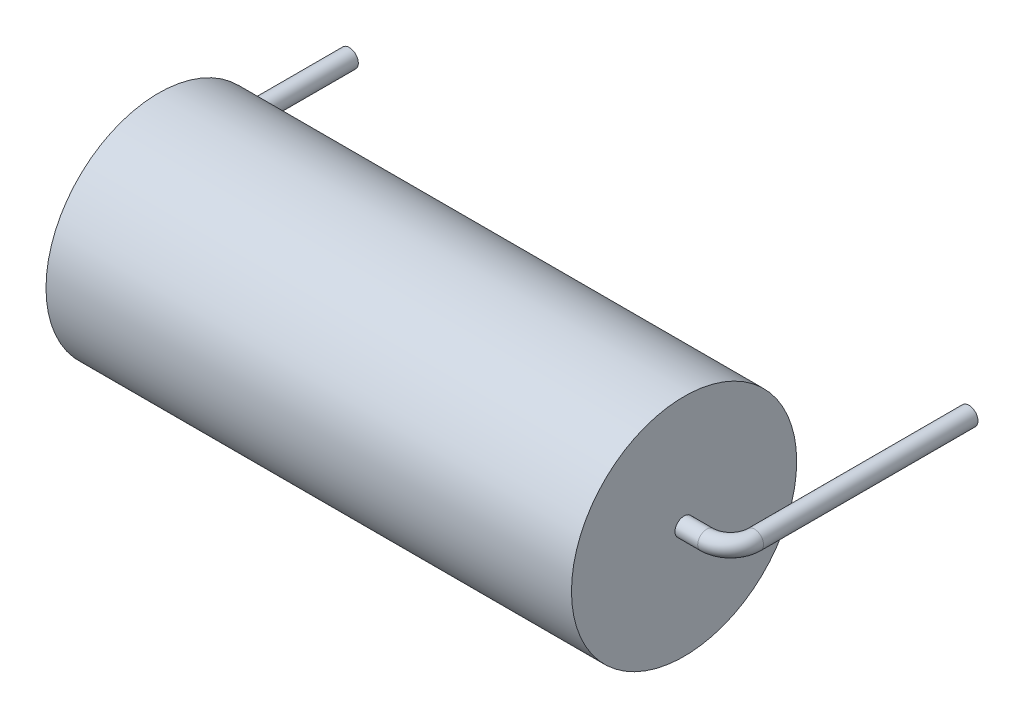
ISO-10303-21;
HEADER;
FILE_DESCRIPTION(('STEP AP214'),'2;1');
FILE_NAME('part.step','',(''),(''),'','','');
FILE_SCHEMA(('AUTOMOTIVE_DESIGN { 1 0 10303 214 1 1 1 1 }'));
ENDSEC;
DATA;
#1=APPLICATION_CONTEXT('core data for automotive mechanical design processes');
#2=APPLICATION_PROTOCOL_DEFINITION('international standard','automotive_design',2000,#1);
#3=PRODUCT_CONTEXT('',#1,'mechanical');
#4=PRODUCT('Part','Part','',(#3));
#5=PRODUCT_RELATED_PRODUCT_CATEGORY('part','',(#4));
#6=PRODUCT_DEFINITION_FORMATION('','',#4);
#7=PRODUCT_DEFINITION_CONTEXT('part definition',#1,'design');
#8=PRODUCT_DEFINITION('design','',#6,#7);
#9=PRODUCT_DEFINITION_SHAPE('','',#8);
#10=(LENGTH_UNIT() NAMED_UNIT(*) SI_UNIT(.MILLI.,.METRE.));
#11=(NAMED_UNIT(*) PLANE_ANGLE_UNIT() SI_UNIT($,.RADIAN.));
#12=(NAMED_UNIT(*) SI_UNIT($,.STERADIAN.) SOLID_ANGLE_UNIT());
#13=UNCERTAINTY_MEASURE_WITH_UNIT(LENGTH_MEASURE(1.E-05),#10,'distance_accuracy_value','');
#14=(GEOMETRIC_REPRESENTATION_CONTEXT(3) GLOBAL_UNCERTAINTY_ASSIGNED_CONTEXT((#13)) GLOBAL_UNIT_ASSIGNED_CONTEXT((#10,
#11,#12)) REPRESENTATION_CONTEXT('',''));
#15=CARTESIAN_POINT('',(0.,0.,0.));
#16=DIRECTION('',(0.,0.,1.));
#17=DIRECTION('',(1.,0.,0.));
#18=AXIS2_PLACEMENT_3D('',#15,#16,#17);
#19=CARTESIAN_POINT('',(77.5947110474384,24.3300808800001,2.5527));
#20=DIRECTION('',(0.,-1.,0.));
#21=DIRECTION('',(0.,0.,-1.));
#22=AXIS2_PLACEMENT_3D('',#19,#20,#21);
#23=TOROIDAL_SURFACE('',#22,0.635,0.2413);
#24=CARTESIAN_POINT('',(78.2297110474384,24.3300808800001,2.5527));
#25=DIRECTION('',(0.,0.,-1.));
#26=DIRECTION('',(-1.,0.,0.));
#27=AXIS2_PLACEMENT_3D('',#24,#25,#26);
#28=CIRCLE('',#27,0.2413);
#29=CARTESIAN_POINT('',(77.9884110474384,24.3300808800001,2.5527));
#30=VERTEX_POINT('',#29);
#31=EDGE_CURVE('E39',#30,#30,#28,.T.);
#32=ORIENTED_EDGE('',*,*,#31,.F.);
#33=EDGE_LOOP('',(#32));
#34=FACE_BOUND('',#33,.T.);
#35=CARTESIAN_POINT('',(77.5947110474384,24.3300808800001,3.1877));
#36=DIRECTION('',(1.,0.,0.));
#37=DIRECTION('',(0.,0.,-1.));
#38=AXIS2_PLACEMENT_3D('',#35,#36,#37);
#39=CIRCLE('',#38,0.2413);
#40=CARTESIAN_POINT('',(77.5947110474384,24.3300808800001,2.9464));
#41=VERTEX_POINT('',#40);
#42=EDGE_CURVE('E11',#41,#41,#39,.T.);
#43=ORIENTED_EDGE('',*,*,#42,.T.);
#44=EDGE_LOOP('',(#43));
#45=FACE_BOUND('',#44,.T.);
#46=ADVANCED_FACE('F16',(#34,#45),#23,.T.);
#47=CARTESIAN_POINT('',(62.3547110474384,24.3300808800001,2.5527));
#48=DIRECTION('',(0.,-1.,0.));
#49=DIRECTION('',(0.,0.,-1.));
#50=AXIS2_PLACEMENT_3D('',#47,#48,#49);
#51=TOROIDAL_SURFACE('',#50,0.635,0.2413);
#52=CARTESIAN_POINT('',(62.3547110474384,24.3300808800001,3.1877));
#53=DIRECTION('',(1.,0.,0.));
#54=DIRECTION('',(0.,0.,-1.));
#55=AXIS2_PLACEMENT_3D('',#52,#53,#54);
#56=CIRCLE('',#55,0.2413);
#57=CARTESIAN_POINT('',(62.3547110474384,24.3300808800001,2.9464));
#58=VERTEX_POINT('',#57);
#59=EDGE_CURVE('E94',#58,#58,#56,.T.);
#60=ORIENTED_EDGE('',*,*,#59,.F.);
#61=EDGE_LOOP('',(#60));
#62=FACE_BOUND('',#61,.T.);
#63=CARTESIAN_POINT('',(61.7197110474384,24.3300808800001,2.5527));
#64=DIRECTION('',(0.,0.,1.));
#65=DIRECTION('',(1.,0.,0.));
#66=AXIS2_PLACEMENT_3D('',#63,#64,#65);
#67=CIRCLE('',#66,0.2413);
#68=CARTESIAN_POINT('',(61.9610110474384,24.3300808800001,2.5527));
#69=VERTEX_POINT('',#68);
#70=EDGE_CURVE('E20',#69,#69,#67,.T.);
#71=ORIENTED_EDGE('',*,*,#70,.T.);
#72=EDGE_LOOP('',(#71));
#73=FACE_BOUND('',#72,.T.);
#74=ADVANCED_FACE('F133',(#62,#73),#51,.T.);
#75=CARTESIAN_POINT('',(61.7197110474384,24.3300808800001,0.0127000000000011));
#76=DIRECTION('',(0.,0.,-1.));
#77=DIRECTION('',(-1.,0.,0.));
#78=AXIS2_PLACEMENT_3D('',#75,#76,#77);
#79=CYLINDRICAL_SURFACE('',#78,0.2413);
#80=ORIENTED_EDGE('',*,*,#70,.F.);
#81=EDGE_LOOP('',(#80));
#82=FACE_BOUND('',#81,.T.);
#83=CARTESIAN_POINT('',(61.7197110474384,24.3300808800001,-3.1623));
#84=DIRECTION('',(0.,0.,1.));
#85=DIRECTION('',(-1.,0.,0.));
#86=AXIS2_PLACEMENT_3D('',#83,#84,#85);
#87=CIRCLE('',#86,0.2413);
#88=CARTESIAN_POINT('',(61.4784110474384,24.3300808800001,-3.1623));
#89=VERTEX_POINT('',#88);
#90=EDGE_CURVE('E74',#89,#89,#87,.T.);
#91=ORIENTED_EDGE('',*,*,#90,.T.);
#92=EDGE_LOOP('',(#91));
#93=FACE_BOUND('',#92,.T.);
#94=ADVANCED_FACE('F18',(#82,#93),#79,.T.);
#95=CARTESIAN_POINT('',(78.2297110474384,24.3300808800001,0.0127000000000011));
#96=DIRECTION('',(0.,0.,-1.));
#97=DIRECTION('',(-1.,0.,0.));
#98=AXIS2_PLACEMENT_3D('',#95,#96,#97);
#99=CYLINDRICAL_SURFACE('',#98,0.2413);
#100=ORIENTED_EDGE('',*,*,#31,.T.);
#101=EDGE_LOOP('',(#100));
#102=FACE_BOUND('',#101,.T.);
#103=CARTESIAN_POINT('',(78.2297110474384,24.3300808800001,-3.1623));
#104=DIRECTION('',(0.,0.,1.));
#105=DIRECTION('',(-1.,0.,0.));
#106=AXIS2_PLACEMENT_3D('',#103,#104,#105);
#107=CIRCLE('',#106,0.2413);
#108=CARTESIAN_POINT('',(77.9884110474384,24.3300808800001,-3.1623));
#109=VERTEX_POINT('',#108);
#110=EDGE_CURVE('E85',#109,#109,#107,.T.);
#111=ORIENTED_EDGE('',*,*,#110,.T.);
#112=EDGE_LOOP('',(#111));
#113=FACE_BOUND('',#112,.T.);
#114=ADVANCED_FACE('F117',(#102,#113),#99,.T.);
#115=CARTESIAN_POINT('',(77.5947110474384,24.3300808800001,3.1877));
#116=DIRECTION('',(-1.,0.,0.));
#117=DIRECTION('',(0.,0.,-1.));
#118=AXIS2_PLACEMENT_3D('',#115,#116,#117);
#119=CYLINDRICAL_SURFACE('',#118,0.2413);
#120=ORIENTED_EDGE('',*,*,#42,.F.);
#121=EDGE_LOOP('',(#120));
#122=FACE_BOUND('',#121,.T.);
#123=CARTESIAN_POINT('',(76.9897110474384,24.3300808800001,3.1877));
#124=DIRECTION('',(1.,0.,0.));
#125=DIRECTION('',(0.,0.,-1.));
#126=AXIS2_PLACEMENT_3D('',#123,#124,#125);
#127=CIRCLE('',#126,0.2413);
#128=CARTESIAN_POINT('',(76.9897110474384,24.3300808800001,2.9464));
#129=VERTEX_POINT('',#128);
#130=EDGE_CURVE('E93',#129,#129,#127,.T.);
#131=ORIENTED_EDGE('',*,*,#130,.T.);
#132=EDGE_LOOP('',(#131));
#133=FACE_BOUND('',#132,.T.);
#134=ADVANCED_FACE('F142',(#122,#133),#119,.T.);
#135=CARTESIAN_POINT('',(77.5947110474384,24.3300808800001,3.1877));
#136=DIRECTION('',(-1.,0.,0.));
#137=DIRECTION('',(0.,0.,-1.));
#138=AXIS2_PLACEMENT_3D('',#135,#136,#137);
#139=CYLINDRICAL_SURFACE('',#138,0.2413);
#140=CARTESIAN_POINT('',(62.9897110474384,24.3300808800001,3.1877));
#141=DIRECTION('',(-1.,0.,0.));
#142=DIRECTION('',(0.,0.,-1.));
#143=AXIS2_PLACEMENT_3D('',#140,#141,#142);
#144=CIRCLE('',#143,0.2413);
#145=CARTESIAN_POINT('',(62.9897110474384,24.3300808800001,3.429));
#146=VERTEX_POINT('',#145);
#147=EDGE_CURVE('E90',#146,#146,#144,.T.);
#148=ORIENTED_EDGE('',*,*,#147,.T.);
#149=EDGE_LOOP('',(#148));
#150=FACE_BOUND('',#149,.T.);
#151=ORIENTED_EDGE('',*,*,#59,.T.);
#152=EDGE_LOOP('',(#151));
#153=FACE_BOUND('',#152,.T.);
#154=ADVANCED_FACE('F145',(#150,#153),#139,.T.);
#155=CARTESIAN_POINT('',(69.9897110474384,24.3300808800001,3.1877));
#156=DIRECTION('',(-1.,0.,0.));
#157=DIRECTION('',(0.,0.,1.));
#158=AXIS2_PLACEMENT_3D('',#155,#156,#157);
#159=CYLINDRICAL_SURFACE('',#158,3.);
#160=CARTESIAN_POINT('',(76.9897110474384,24.3300808800001,3.1877));
#161=DIRECTION('',(-1.,0.,0.));
#162=DIRECTION('',(0.,0.,1.));
#163=AXIS2_PLACEMENT_3D('',#160,#161,#162);
#164=CIRCLE('',#163,3.);
#165=CARTESIAN_POINT('',(76.9897110474384,24.3300808800001,0.1877));
#166=VERTEX_POINT('',#165);
#167=EDGE_CURVE('E104',#166,#166,#164,.T.);
#168=ORIENTED_EDGE('',*,*,#167,.T.);
#169=EDGE_LOOP('',(#168));
#170=FACE_BOUND('',#169,.T.);
#171=CARTESIAN_POINT('',(62.9897110474384,24.3300808800001,3.1877));
#172=DIRECTION('',(-1.,0.,0.));
#173=DIRECTION('',(0.,0.,1.));
#174=AXIS2_PLACEMENT_3D('',#171,#172,#173);
#175=CIRCLE('',#174,3.);
#176=CARTESIAN_POINT('',(62.9897110474384,24.3300808800001,6.1877));
#177=VERTEX_POINT('',#176);
#178=EDGE_CURVE('E88',#177,#177,#175,.T.);
#179=ORIENTED_EDGE('',*,*,#178,.F.);
#180=EDGE_LOOP('',(#179));
#181=FACE_BOUND('',#180,.T.);
#182=ADVANCED_FACE('F148',(#170,#181),#159,.T.);
#183=CARTESIAN_POINT('',(76.9897110474384,24.3300808800001,4.6877));
#184=DIRECTION('',(1.,0.,0.));
#185=DIRECTION('',(0.,1.,0.));
#186=AXIS2_PLACEMENT_3D('',#183,#184,#185);
#187=PLANE('',#186);
#188=ORIENTED_EDGE('',*,*,#167,.F.);
#189=EDGE_LOOP('',(#188));
#190=FACE_BOUND('',#189,.T.);
#191=ORIENTED_EDGE('',*,*,#130,.F.);
#192=EDGE_LOOP('',(#191));
#193=FACE_BOUND('',#192,.T.);
#194=ADVANCED_FACE('F128',(#190,#193),#187,.T.);
#195=CARTESIAN_POINT('',(62.9897110474384,24.3300808800001,4.6877));
#196=DIRECTION('',(-1.,0.,0.));
#197=DIRECTION('',(0.,0.,1.));
#198=AXIS2_PLACEMENT_3D('',#195,#196,#197);
#199=PLANE('',#198);
#200=ORIENTED_EDGE('',*,*,#178,.T.);
#201=EDGE_LOOP('',(#200));
#202=FACE_BOUND('',#201,.T.);
#203=ORIENTED_EDGE('',*,*,#147,.F.);
#204=EDGE_LOOP('',(#203));
#205=FACE_BOUND('',#204,.T.);
#206=ADVANCED_FACE('F121',(#202,#205),#199,.T.);
#207=CARTESIAN_POINT('',(78.2297110474384,24.3300808800001,-3.1623));
#208=DIRECTION('',(0.,0.,-1.));
#209=DIRECTION('',(0.,-1.,0.));
#210=AXIS2_PLACEMENT_3D('',#207,#208,#209);
#211=PLANE('',#210);
#212=ORIENTED_EDGE('',*,*,#110,.F.);
#213=EDGE_LOOP('',(#212));
#214=FACE_BOUND('',#213,.T.);
#215=ADVANCED_FACE('F119',(#214),#211,.T.);
#216=CARTESIAN_POINT('',(61.7197110474384,24.3300808800001,-3.1623));
#217=DIRECTION('',(0.,0.,-1.));
#218=DIRECTION('',(0.,-1.,0.));
#219=AXIS2_PLACEMENT_3D('',#216,#217,#218);
#220=PLANE('',#219);
#221=ORIENTED_EDGE('',*,*,#90,.F.);
#222=EDGE_LOOP('',(#221));
#223=FACE_BOUND('',#222,.T.);
#224=ADVANCED_FACE('F75',(#223),#220,.T.);
#225=CLOSED_SHELL('',(#46,#74,#94,#114,#134,#154,#182,#194,#206,#215,#224));
#226=MANIFOLD_SOLID_BREP('B1',#225);
#227=ADVANCED_BREP_SHAPE_REPRESENTATION('',(#18,#226),#14);
#228=SHAPE_DEFINITION_REPRESENTATION(#9,#227);
ENDSEC;
END-ISO-10303-21;
